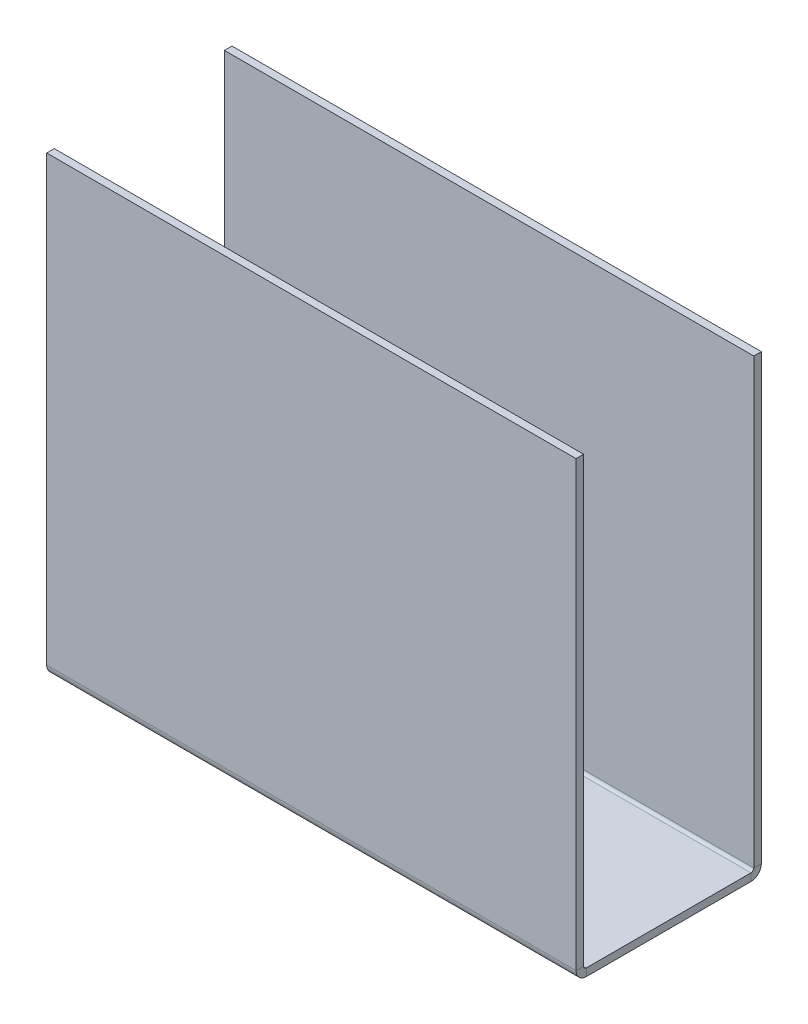
ISO-10303-21;
HEADER;
FILE_DESCRIPTION(('STEP AP214'),'2;1');
FILE_NAME('part.step','',(''),(''),'','','');
FILE_SCHEMA(('AUTOMOTIVE_DESIGN { 1 0 10303 214 1 1 1 1 }'));
ENDSEC;
DATA;
#1=APPLICATION_CONTEXT('core data for automotive mechanical design processes');
#2=APPLICATION_PROTOCOL_DEFINITION('international standard','automotive_design',2000,#1);
#3=PRODUCT_CONTEXT('',#1,'mechanical');
#4=PRODUCT('Part','Part','',(#3));
#5=PRODUCT_RELATED_PRODUCT_CATEGORY('part','',(#4));
#6=PRODUCT_DEFINITION_FORMATION('','',#4);
#7=PRODUCT_DEFINITION_CONTEXT('part definition',#1,'design');
#8=PRODUCT_DEFINITION('design','',#6,#7);
#9=PRODUCT_DEFINITION_SHAPE('','',#8);
#10=(LENGTH_UNIT() NAMED_UNIT(*) SI_UNIT(.MILLI.,.METRE.));
#11=(NAMED_UNIT(*) PLANE_ANGLE_UNIT() SI_UNIT($,.RADIAN.));
#12=(NAMED_UNIT(*) SI_UNIT($,.STERADIAN.) SOLID_ANGLE_UNIT());
#13=UNCERTAINTY_MEASURE_WITH_UNIT(LENGTH_MEASURE(1.E-05),#10,'distance_accuracy_value','');
#14=(GEOMETRIC_REPRESENTATION_CONTEXT(3) GLOBAL_UNCERTAINTY_ASSIGNED_CONTEXT((#13)) GLOBAL_UNIT_ASSIGNED_CONTEXT((#10,
#11,#12)) REPRESENTATION_CONTEXT('',''));
#15=CARTESIAN_POINT('',(0.,0.,0.));
#16=DIRECTION('',(0.,0.,1.));
#17=DIRECTION('',(1.,0.,0.));
#18=AXIS2_PLACEMENT_3D('',#15,#16,#17);
#19=CARTESIAN_POINT('',(0.,-2.,0.));
#20=DIRECTION('',(0.,1.,0.));
#21=DIRECTION('',(0.,0.,1.));
#22=AXIS2_PLACEMENT_3D('',#19,#20,#21);
#23=PLANE('',#22);
#24=DIRECTION('',(1.,0.,0.));
#25=VECTOR('',#24,1.);
#26=CARTESIAN_POINT('',(26.615107913669,-2.,33.4846230215827));
#27=LINE('',#26,#25);
#28=CARTESIAN_POINT('',(26.6151079136691,-2.,33.4846230215827));
#29=VERTEX_POINT('',#28);
#30=CARTESIAN_POINT('',(-113.384892086331,-2.,33.4846230215827));
#31=VERTEX_POINT('',#30);
#32=EDGE_CURVE('E211',#29,#31,#27,.F.);
#33=ORIENTED_EDGE('',*,*,#32,.T.);
#34=DIRECTION('',(0.,0.,1.));
#35=VECTOR('',#34,1.);
#36=CARTESIAN_POINT('',(-113.384892086331,-2.,-12.7787769784173));
#37=LINE('',#36,#35);
#38=CARTESIAN_POINT('',(-113.384892086331,-2.00000000000002,-10.0421769784173));
#39=VERTEX_POINT('',#38);
#40=EDGE_CURVE('E88',#39,#31,#37,.T.);
#41=ORIENTED_EDGE('',*,*,#40,.F.);
#42=DIRECTION('',(-1.,0.,0.));
#43=VECTOR('',#42,1.);
#44=CARTESIAN_POINT('',(-113.384892086331,-2.00000000000002,-10.0421769784173));
#45=LINE('',#44,#43);
#46=CARTESIAN_POINT('',(26.615107913669,-2.,-10.0421769784173));
#47=VERTEX_POINT('',#46);
#48=EDGE_CURVE('E264',#39,#47,#45,.F.);
#49=ORIENTED_EDGE('',*,*,#48,.T.);
#50=DIRECTION('',(0.,0.,-1.));
#51=VECTOR('',#50,1.);
#52=CARTESIAN_POINT('',(26.6151079136691,-2.,-12.7787769784173));
#53=LINE('',#52,#51);
#54=EDGE_CURVE('E13',#29,#47,#53,.T.);
#55=ORIENTED_EDGE('',*,*,#54,.F.);
#56=EDGE_LOOP('',(#33,#41,#49,#55));
#57=FACE_BOUND('',#56,.T.);
#58=ADVANCED_FACE('F79',(#57),#23,.F.);
#59=CARTESIAN_POINT('',(0.,0.,0.));
#60=DIRECTION('',(0.,1.,0.));
#61=DIRECTION('',(0.,0.,1.));
#62=AXIS2_PLACEMENT_3D('',#59,#60,#61);
#63=PLANE('',#62);
#64=DIRECTION('',(0.,0.,1.));
#65=VECTOR('',#64,1.);
#66=CARTESIAN_POINT('',(-113.384892086331,0.,-12.7787769784173));
#67=LINE('',#66,#65);
#68=CARTESIAN_POINT('',(-113.384892086331,0.,-10.0421769784173));
#69=VERTEX_POINT('',#68);
#70=CARTESIAN_POINT('',(-113.384892086331,0.,33.4846230215827));
#71=VERTEX_POINT('',#70);
#72=EDGE_CURVE('E282',#69,#71,#67,.T.);
#73=ORIENTED_EDGE('',*,*,#72,.T.);
#74=DIRECTION('',(1.,0.,0.));
#75=VECTOR('',#74,1.);
#76=CARTESIAN_POINT('',(26.615107913669,0.,33.4846230215827));
#77=LINE('',#76,#75);
#78=CARTESIAN_POINT('',(26.6151079136691,0.,33.4846230215827));
#79=VERTEX_POINT('',#78);
#80=EDGE_CURVE('E223',#79,#71,#77,.F.);
#81=ORIENTED_EDGE('',*,*,#80,.F.);
#82=DIRECTION('',(0.,0.,-1.));
#83=VECTOR('',#82,1.);
#84=CARTESIAN_POINT('',(26.6151079136691,0.,-12.7787769784173));
#85=LINE('',#84,#83);
#86=CARTESIAN_POINT('',(26.615107913669,0.,-10.0421769784173));
#87=VERTEX_POINT('',#86);
#88=EDGE_CURVE('E83',#79,#87,#85,.T.);
#89=ORIENTED_EDGE('',*,*,#88,.T.);
#90=DIRECTION('',(-1.,0.,0.));
#91=VECTOR('',#90,1.);
#92=CARTESIAN_POINT('',(-113.384892086331,0.,-10.0421769784173));
#93=LINE('',#92,#91);
#94=EDGE_CURVE('E96',#69,#87,#93,.F.);
#95=ORIENTED_EDGE('',*,*,#94,.F.);
#96=EDGE_LOOP('',(#73,#81,#89,#95));
#97=FACE_BOUND('',#96,.T.);
#98=ADVANCED_FACE('F287',(#97),#63,.T.);
#99=CARTESIAN_POINT('',(26.6151079136691,-2.,-12.7787769784173));
#100=DIRECTION('',(1.,0.,0.));
#101=DIRECTION('',(0.,0.,-1.));
#102=AXIS2_PLACEMENT_3D('',#99,#100,#101);
#103=PLANE('',#102);
#104=ORIENTED_EDGE('',*,*,#88,.F.);
#105=DIRECTION('',(0.,-1.,0.));
#106=VECTOR('',#105,1.);
#107=CARTESIAN_POINT('',(26.6151079136691,0.,33.4846230215827));
#108=LINE('',#107,#106);
#109=EDGE_CURVE('E217',#79,#29,#108,.T.);
#110=ORIENTED_EDGE('',*,*,#109,.T.);
#111=ORIENTED_EDGE('',*,*,#54,.T.);
#112=DIRECTION('',(0.,-1.,0.));
#113=VECTOR('',#112,1.);
#114=CARTESIAN_POINT('',(26.615107913669,0.,-10.0421769784173));
#115=LINE('',#114,#113);
#116=EDGE_CURVE('E279',#87,#47,#115,.T.);
#117=ORIENTED_EDGE('',*,*,#116,.F.);
#118=EDGE_LOOP('',(#104,#110,#111,#117));
#119=FACE_BOUND('',#118,.T.);
#120=ADVANCED_FACE('F289',(#119),#103,.T.);
#121=CARTESIAN_POINT('',(-113.384892086331,-2.,-12.7787769784173));
#122=DIRECTION('',(-1.,0.,0.));
#123=DIRECTION('',(0.,0.,1.));
#124=AXIS2_PLACEMENT_3D('',#121,#122,#123);
#125=PLANE('',#124);
#126=DIRECTION('',(0.,-1.,0.));
#127=VECTOR('',#126,1.);
#128=CARTESIAN_POINT('',(-113.384892086331,0.,33.4846230215827));
#129=LINE('',#128,#127);
#130=EDGE_CURVE('E229',#71,#31,#129,.T.);
#131=ORIENTED_EDGE('',*,*,#130,.F.);
#132=ORIENTED_EDGE('',*,*,#72,.F.);
#133=DIRECTION('',(0.,-1.,0.));
#134=VECTOR('',#133,1.);
#135=CARTESIAN_POINT('',(-113.384892086331,0.,-10.0421769784173));
#136=LINE('',#135,#134);
#137=EDGE_CURVE('E270',#69,#39,#136,.T.);
#138=ORIENTED_EDGE('',*,*,#137,.T.);
#139=ORIENTED_EDGE('',*,*,#40,.T.);
#140=EDGE_LOOP('',(#131,#132,#138,#139));
#141=FACE_BOUND('',#140,.T.);
#142=ADVANCED_FACE('F81',(#141),#125,.T.);
#143=CARTESIAN_POINT('',(26.615107913669,0.736599999999995,-10.0421769784173));
#144=DIRECTION('',(1.,0.,0.));
#145=DIRECTION('',(0.,1.,0.));
#146=AXIS2_PLACEMENT_3D('',#143,#144,#145);
#147=PLANE('',#146);
#148=DIRECTION('',(0.,0.,1.));
#149=VECTOR('',#148,1.);
#150=CARTESIAN_POINT('',(26.6151079136691,0.736600000000011,-12.7787769784173));
#151=LINE('',#150,#149);
#152=CARTESIAN_POINT('',(26.615107913669,0.736599999999993,-10.7787769784173));
#153=VERTEX_POINT('',#152);
#154=CARTESIAN_POINT('',(26.6151079136689,0.736599999999986,-12.7787769784173));
#155=VERTEX_POINT('',#154);
#156=EDGE_CURVE('E232',#153,#155,#151,.F.);
#157=ORIENTED_EDGE('',*,*,#156,.F.);
#158=CARTESIAN_POINT('',(26.615107913669,0.736599999999995,-10.0421769784173));
#159=DIRECTION('',(-1.,0.,0.));
#160=DIRECTION('',(0.,-1.,0.));
#161=AXIS2_PLACEMENT_3D('',#158,#159,#160);
#162=CIRCLE('',#161,0.7366);
#163=EDGE_CURVE('E273',#87,#153,#162,.F.);
#164=ORIENTED_EDGE('',*,*,#163,.F.);
#165=ORIENTED_EDGE('',*,*,#116,.T.);
#166=CARTESIAN_POINT('',(26.6151079136689,0.736599999999995,-10.0421769784173));
#167=DIRECTION('',(-1.,0.,0.));
#168=DIRECTION('',(0.,-1.,0.));
#169=AXIS2_PLACEMENT_3D('',#166,#167,#168);
#170=CIRCLE('',#169,2.7366);
#171=EDGE_CURVE('E266',#47,#155,#170,.F.);
#172=ORIENTED_EDGE('',*,*,#171,.T.);
#173=EDGE_LOOP('',(#157,#164,#165,#172));
#174=FACE_BOUND('',#173,.T.);
#175=ADVANCED_FACE('F297',(#174),#147,.T.);
#176=CARTESIAN_POINT('',(-113.384892086331,0.736599999999985,-10.0421769784173));
#177=DIRECTION('',(1.,0.,0.));
#178=DIRECTION('',(0.,1.,0.));
#179=AXIS2_PLACEMENT_3D('',#176,#177,#178);
#180=PLANE('',#179);
#181=CARTESIAN_POINT('',(-113.384892086331,0.736599999999985,-10.0421769784173));
#182=DIRECTION('',(-1.,0.,0.));
#183=DIRECTION('',(0.,-1.,0.));
#184=AXIS2_PLACEMENT_3D('',#181,#182,#183);
#185=CIRCLE('',#184,0.7366);
#186=CARTESIAN_POINT('',(-113.384892086331,0.736599999999982,-10.7787769784173));
#187=VERTEX_POINT('',#186);
#188=EDGE_CURVE('E237',#187,#69,#185,.T.);
#189=ORIENTED_EDGE('',*,*,#188,.F.);
#190=DIRECTION('',(0.,0.,1.));
#191=VECTOR('',#190,1.);
#192=CARTESIAN_POINT('',(-113.384892086331,0.736599999999993,-10.7787769784173));
#193=LINE('',#192,#191);
#194=CARTESIAN_POINT('',(-113.384892086331,0.736600000000007,-12.7787769784173));
#195=VERTEX_POINT('',#194);
#196=EDGE_CURVE('E257',#187,#195,#193,.F.);
#197=ORIENTED_EDGE('',*,*,#196,.T.);
#198=CARTESIAN_POINT('',(-113.384892086331,0.736599999999985,-10.0421769784173));
#199=DIRECTION('',(-1.,0.,0.));
#200=DIRECTION('',(0.,-1.,0.));
#201=AXIS2_PLACEMENT_3D('',#198,#199,#200);
#202=CIRCLE('',#201,2.7366);
#203=EDGE_CURVE('E267',#195,#39,#202,.T.);
#204=ORIENTED_EDGE('',*,*,#203,.T.);
#205=ORIENTED_EDGE('',*,*,#137,.F.);
#206=EDGE_LOOP('',(#189,#197,#204,#205));
#207=FACE_BOUND('',#206,.T.);
#208=ADVANCED_FACE('F318',(#207),#180,.F.);
#209=CARTESIAN_POINT('',(-113.384892086331,0.736599999999985,-10.0421769784173));
#210=DIRECTION('',(-1.,0.,0.));
#211=DIRECTION('',(0.,0.,-1.));
#212=AXIS2_PLACEMENT_3D('',#209,#210,#211);
#213=CYLINDRICAL_SURFACE('',#212,2.7366);
#214=ORIENTED_EDGE('',*,*,#48,.F.);
#215=ORIENTED_EDGE('',*,*,#203,.F.);
#216=DIRECTION('',(-1.,0.,0.));
#217=VECTOR('',#216,1.);
#218=CARTESIAN_POINT('',(26.6151079136691,0.736600000000011,-12.7787769784173));
#219=LINE('',#218,#217);
#220=EDGE_CURVE('E255',#195,#155,#219,.F.);
#221=ORIENTED_EDGE('',*,*,#220,.T.);
#222=ORIENTED_EDGE('',*,*,#171,.F.);
#223=EDGE_LOOP('',(#214,#215,#221,#222));
#224=FACE_BOUND('',#223,.T.);
#225=ADVANCED_FACE('F497',(#224),#213,.T.);
#226=CARTESIAN_POINT('',(-113.384892086331,0.736599999999985,-10.0421769784173));
#227=DIRECTION('',(-1.,0.,0.));
#228=DIRECTION('',(0.,0.,-1.));
#229=AXIS2_PLACEMENT_3D('',#226,#227,#228);
#230=CYLINDRICAL_SURFACE('',#229,0.7366);
#231=ORIENTED_EDGE('',*,*,#94,.T.);
#232=ORIENTED_EDGE('',*,*,#163,.T.);
#233=DIRECTION('',(-1.,0.,0.));
#234=VECTOR('',#233,1.);
#235=CARTESIAN_POINT('',(26.6151079136691,0.736599999999997,-10.7787769784173));
#236=LINE('',#235,#234);
#237=EDGE_CURVE('E260',#153,#187,#236,.T.);
#238=ORIENTED_EDGE('',*,*,#237,.T.);
#239=ORIENTED_EDGE('',*,*,#188,.T.);
#240=EDGE_LOOP('',(#231,#232,#238,#239));
#241=FACE_BOUND('',#240,.T.);
#242=ADVANCED_FACE('F294',(#241),#230,.F.);
#243=CARTESIAN_POINT('',(26.6151079136691,0.,-12.7787769784173));
#244=DIRECTION('',(-1.,0.,0.));
#245=DIRECTION('',(0.,0.,1.));
#246=AXIS2_PLACEMENT_3D('',#243,#244,#245);
#247=PLANE('',#246);
#248=ORIENTED_EDGE('',*,*,#156,.T.);
#249=DIRECTION('',(0.,-1.,0.));
#250=VECTOR('',#249,1.);
#251=CARTESIAN_POINT('',(26.6151079136691,0.,-12.7787769784173));
#252=LINE('',#251,#250);
#253=CARTESIAN_POINT('',(26.6151079136691,118.,-12.7787769784177));
#254=VERTEX_POINT('',#253);
#255=EDGE_CURVE('E245',#254,#155,#252,.T.);
#256=ORIENTED_EDGE('',*,*,#255,.F.);
#257=DIRECTION('',(0.,0.,1.));
#258=VECTOR('',#257,1.);
#259=CARTESIAN_POINT('',(26.6151079136691,118.,-12.7787769784177));
#260=LINE('',#259,#258);
#261=CARTESIAN_POINT('',(26.6151079136691,118.,-10.7787769784177));
#262=VERTEX_POINT('',#261);
#263=EDGE_CURVE('E238',#254,#262,#260,.T.);
#264=ORIENTED_EDGE('',*,*,#263,.T.);
#265=DIRECTION('',(0.,1.,0.));
#266=VECTOR('',#265,1.);
#267=CARTESIAN_POINT('',(26.6151079136691,0.,-10.7787769784173));
#268=LINE('',#267,#266);
#269=EDGE_CURVE('E252',#262,#153,#268,.F.);
#270=ORIENTED_EDGE('',*,*,#269,.T.);
#271=EDGE_LOOP('',(#248,#256,#264,#270));
#272=FACE_BOUND('',#271,.T.);
#273=ADVANCED_FACE('F300',(#272),#247,.F.);
#274=CARTESIAN_POINT('',(-113.384892086331,118.,-12.7787769784177));
#275=DIRECTION('',(1.,0.,0.));
#276=DIRECTION('',(0.,0.,-1.));
#277=AXIS2_PLACEMENT_3D('',#274,#275,#276);
#278=PLANE('',#277);
#279=ORIENTED_EDGE('',*,*,#196,.F.);
#280=DIRECTION('',(0.,-1.,0.));
#281=VECTOR('',#280,1.);
#282=CARTESIAN_POINT('',(-113.384892086331,118.,-10.7787769784177));
#283=LINE('',#282,#281);
#284=CARTESIAN_POINT('',(-113.384892086331,118.,-10.7787769784177));
#285=VERTEX_POINT('',#284);
#286=EDGE_CURVE('E250',#187,#285,#283,.F.);
#287=ORIENTED_EDGE('',*,*,#286,.T.);
#288=DIRECTION('',(0.,0.,1.));
#289=VECTOR('',#288,1.);
#290=CARTESIAN_POINT('',(-113.384892086331,118.,-12.7787769784177));
#291=LINE('',#290,#289);
#292=CARTESIAN_POINT('',(-113.384892086331,118.,-12.7787769784177));
#293=VERTEX_POINT('',#292);
#294=EDGE_CURVE('E234',#293,#285,#291,.T.);
#295=ORIENTED_EDGE('',*,*,#294,.F.);
#296=DIRECTION('',(0.,1.,0.));
#297=VECTOR('',#296,1.);
#298=CARTESIAN_POINT('',(-113.384892086331,0.,-12.7787769784173));
#299=LINE('',#298,#297);
#300=EDGE_CURVE('E243',#195,#293,#299,.T.);
#301=ORIENTED_EDGE('',*,*,#300,.F.);
#302=EDGE_LOOP('',(#279,#287,#295,#301));
#303=FACE_BOUND('',#302,.T.);
#304=ADVANCED_FACE('F320',(#303),#278,.F.);
#305=CARTESIAN_POINT('',(0.,0.,-12.7787769784173));
#306=DIRECTION('',(0.,0.,1.));
#307=DIRECTION('',(0.,-1.,0.));
#308=AXIS2_PLACEMENT_3D('',#305,#306,#307);
#309=PLANE('',#308);
#310=ORIENTED_EDGE('',*,*,#220,.F.);
#311=ORIENTED_EDGE('',*,*,#300,.T.);
#312=DIRECTION('',(1.,0.,0.));
#313=VECTOR('',#312,1.);
#314=CARTESIAN_POINT('',(0.,118.,-12.7787769784177));
#315=LINE('',#314,#313);
#316=EDGE_CURVE('E241',#293,#254,#315,.T.);
#317=ORIENTED_EDGE('',*,*,#316,.T.);
#318=ORIENTED_EDGE('',*,*,#255,.T.);
#319=EDGE_LOOP('',(#310,#311,#317,#318));
#320=FACE_BOUND('',#319,.T.);
#321=ADVANCED_FACE('F304',(#320),#309,.F.);
#322=CARTESIAN_POINT('',(0.,0.,-10.7787769784173));
#323=DIRECTION('',(0.,0.,1.));
#324=DIRECTION('',(0.,-1.,0.));
#325=AXIS2_PLACEMENT_3D('',#322,#323,#324);
#326=PLANE('',#325);
#327=ORIENTED_EDGE('',*,*,#286,.F.);
#328=ORIENTED_EDGE('',*,*,#237,.F.);
#329=ORIENTED_EDGE('',*,*,#269,.F.);
#330=DIRECTION('',(-1.,0.,0.));
#331=VECTOR('',#330,1.);
#332=CARTESIAN_POINT('',(26.6151079136691,118.,-10.7787769784177));
#333=LINE('',#332,#331);
#334=EDGE_CURVE('E248',#285,#262,#333,.F.);
#335=ORIENTED_EDGE('',*,*,#334,.F.);
#336=EDGE_LOOP('',(#327,#328,#329,#335));
#337=FACE_BOUND('',#336,.T.);
#338=ADVANCED_FACE('F314',(#337),#326,.T.);
#339=CARTESIAN_POINT('',(26.6151079136691,118.,-12.7787769784177));
#340=DIRECTION('',(0.,-1.,0.));
#341=DIRECTION('',(0.,0.,-1.));
#342=AXIS2_PLACEMENT_3D('',#339,#340,#341);
#343=PLANE('',#342);
#344=ORIENTED_EDGE('',*,*,#334,.T.);
#345=ORIENTED_EDGE('',*,*,#263,.F.);
#346=ORIENTED_EDGE('',*,*,#316,.F.);
#347=ORIENTED_EDGE('',*,*,#294,.T.);
#348=EDGE_LOOP('',(#344,#345,#346,#347));
#349=FACE_BOUND('',#348,.T.);
#350=ADVANCED_FACE('F310',(#349),#343,.F.);
#351=CARTESIAN_POINT('',(-113.384892086331,0.736599999999997,33.4846230215827));
#352=DIRECTION('',(-1.,0.,0.));
#353=DIRECTION('',(0.,0.,1.));
#354=AXIS2_PLACEMENT_3D('',#351,#352,#353);
#355=PLANE('',#354);
#356=DIRECTION('',(0.,0.,-1.));
#357=VECTOR('',#356,1.);
#358=CARTESIAN_POINT('',(-113.384892086331,0.736599999999997,36.2212230215827));
#359=LINE('',#358,#357);
#360=CARTESIAN_POINT('',(-113.384892086331,0.736599999999997,34.2212230215827));
#361=VERTEX_POINT('',#360);
#362=CARTESIAN_POINT('',(-113.384892086331,0.736599999999997,36.2212230215827));
#363=VERTEX_POINT('',#362);
#364=EDGE_CURVE('E194',#361,#363,#359,.F.);
#365=ORIENTED_EDGE('',*,*,#364,.F.);
#366=CARTESIAN_POINT('',(-113.384892086331,0.736599999999997,33.4846230215827));
#367=DIRECTION('',(1.,0.,0.));
#368=DIRECTION('',(0.,0.,-1.));
#369=AXIS2_PLACEMENT_3D('',#366,#367,#368);
#370=CIRCLE('',#369,0.736599999999997);
#371=EDGE_CURVE('E220',#71,#361,#370,.F.);
#372=ORIENTED_EDGE('',*,*,#371,.F.);
#373=ORIENTED_EDGE('',*,*,#130,.T.);
#374=CARTESIAN_POINT('',(-113.384892086331,0.736599999999997,33.4846230215827));
#375=DIRECTION('',(1.,0.,0.));
#376=DIRECTION('',(0.,0.,-1.));
#377=AXIS2_PLACEMENT_3D('',#374,#375,#376);
#378=CIRCLE('',#377,2.7366);
#379=EDGE_CURVE('E213',#31,#363,#378,.F.);
#380=ORIENTED_EDGE('',*,*,#379,.T.);
#381=EDGE_LOOP('',(#365,#372,#373,#380));
#382=FACE_BOUND('',#381,.T.);
#383=ADVANCED_FACE('F350',(#382),#355,.T.);
#384=CARTESIAN_POINT('',(26.6151079136691,0.736599999999997,33.4846230215827));
#385=DIRECTION('',(-1.,0.,0.));
#386=DIRECTION('',(0.,0.,1.));
#387=AXIS2_PLACEMENT_3D('',#384,#385,#386);
#388=PLANE('',#387);
#389=CARTESIAN_POINT('',(26.6151079136691,0.736599999999997,33.4846230215827));
#390=DIRECTION('',(1.,0.,0.));
#391=DIRECTION('',(0.,0.,-1.));
#392=AXIS2_PLACEMENT_3D('',#389,#390,#391);
#393=CIRCLE('',#392,0.736599999999997);
#394=CARTESIAN_POINT('',(26.6151079136691,0.736599999999997,34.2212230215827));
#395=VERTEX_POINT('',#394);
#396=EDGE_CURVE('E226',#395,#79,#393,.T.);
#397=ORIENTED_EDGE('',*,*,#396,.F.);
#398=DIRECTION('',(0.,0.,-1.));
#399=VECTOR('',#398,1.);
#400=CARTESIAN_POINT('',(26.6151079136691,0.736599999999997,34.2212230215827));
#401=LINE('',#400,#399);
#402=CARTESIAN_POINT('',(26.6151079136691,0.736599999999997,36.2212230215827));
#403=VERTEX_POINT('',#402);
#404=EDGE_CURVE('E205',#395,#403,#401,.F.);
#405=ORIENTED_EDGE('',*,*,#404,.T.);
#406=CARTESIAN_POINT('',(26.6151079136691,0.736599999999997,33.4846230215827));
#407=DIRECTION('',(1.,0.,0.));
#408=DIRECTION('',(0.,0.,-1.));
#409=AXIS2_PLACEMENT_3D('',#406,#407,#408);
#410=CIRCLE('',#409,2.7366);
#411=EDGE_CURVE('E214',#403,#29,#410,.T.);
#412=ORIENTED_EDGE('',*,*,#411,.T.);
#413=ORIENTED_EDGE('',*,*,#109,.F.);
#414=EDGE_LOOP('',(#397,#405,#412,#413));
#415=FACE_BOUND('',#414,.T.);
#416=ADVANCED_FACE('F366',(#415),#388,.F.);
#417=CARTESIAN_POINT('',(26.615107913669,0.736599999999997,33.4846230215827));
#418=DIRECTION('',(1.,0.,0.));
#419=DIRECTION('',(0.,0.,1.));
#420=AXIS2_PLACEMENT_3D('',#417,#418,#419);
#421=CYLINDRICAL_SURFACE('',#420,2.7366);
#422=ORIENTED_EDGE('',*,*,#32,.F.);
#423=ORIENTED_EDGE('',*,*,#411,.F.);
#424=DIRECTION('',(1.,0.,0.));
#425=VECTOR('',#424,1.);
#426=CARTESIAN_POINT('',(-113.384892086331,0.736599999999997,36.2212230215827));
#427=LINE('',#426,#425);
#428=EDGE_CURVE('E203',#403,#363,#427,.F.);
#429=ORIENTED_EDGE('',*,*,#428,.T.);
#430=ORIENTED_EDGE('',*,*,#379,.F.);
#431=EDGE_LOOP('',(#422,#423,#429,#430));
#432=FACE_BOUND('',#431,.T.);
#433=ADVANCED_FACE('F353',(#432),#421,.T.);
#434=CARTESIAN_POINT('',(26.615107913669,0.736599999999997,33.4846230215827));
#435=DIRECTION('',(1.,0.,0.));
#436=DIRECTION('',(0.,0.,1.));
#437=AXIS2_PLACEMENT_3D('',#434,#435,#436);
#438=CYLINDRICAL_SURFACE('',#437,0.736599999999997);
#439=ORIENTED_EDGE('',*,*,#80,.T.);
#440=ORIENTED_EDGE('',*,*,#371,.T.);
#441=DIRECTION('',(1.,0.,0.));
#442=VECTOR('',#441,1.);
#443=CARTESIAN_POINT('',(-113.384892086331,0.736599999999997,34.2212230215827));
#444=LINE('',#443,#442);
#445=EDGE_CURVE('E208',#361,#395,#444,.T.);
#446=ORIENTED_EDGE('',*,*,#445,.T.);
#447=ORIENTED_EDGE('',*,*,#396,.T.);
#448=EDGE_LOOP('',(#439,#440,#446,#447));
#449=FACE_BOUND('',#448,.T.);
#450=ADVANCED_FACE('F364',(#449),#438,.F.);
#451=CARTESIAN_POINT('',(-113.384892086331,0.,36.2212230215827));
#452=DIRECTION('',(1.,0.,0.));
#453=DIRECTION('',(0.,0.,-1.));
#454=AXIS2_PLACEMENT_3D('',#451,#452,#453);
#455=PLANE('',#454);
#456=ORIENTED_EDGE('',*,*,#364,.T.);
#457=DIRECTION('',(0.,-1.,0.));
#458=VECTOR('',#457,1.);
#459=CARTESIAN_POINT('',(-113.384892086331,0.,36.2212230215827));
#460=LINE('',#459,#458);
#461=CARTESIAN_POINT('',(-113.384892086331,118.,36.2212230215827));
#462=VERTEX_POINT('',#461);
#463=EDGE_CURVE('E175',#462,#363,#460,.T.);
#464=ORIENTED_EDGE('',*,*,#463,.F.);
#465=DIRECTION('',(0.,0.,-1.));
#466=VECTOR('',#465,1.);
#467=CARTESIAN_POINT('',(-113.384892086331,118.,36.2212230215827));
#468=LINE('',#467,#466);
#469=CARTESIAN_POINT('',(-113.384892086331,118.,34.2212230215827));
#470=VERTEX_POINT('',#469);
#471=EDGE_CURVE('E181',#462,#470,#468,.T.);
#472=ORIENTED_EDGE('',*,*,#471,.T.);
#473=DIRECTION('',(0.,1.,0.));
#474=VECTOR('',#473,1.);
#475=CARTESIAN_POINT('',(-113.384892086331,0.,34.2212230215827));
#476=LINE('',#475,#474);
#477=EDGE_CURVE('E201',#470,#361,#476,.F.);
#478=ORIENTED_EDGE('',*,*,#477,.T.);
#479=EDGE_LOOP('',(#456,#464,#472,#478));
#480=FACE_BOUND('',#479,.T.);
#481=ADVANCED_FACE('F193',(#480),#455,.F.);
#482=CARTESIAN_POINT('',(26.6151079136691,118.,36.2212230215827));
#483=DIRECTION('',(-1.,0.,0.));
#484=DIRECTION('',(0.,0.,1.));
#485=AXIS2_PLACEMENT_3D('',#482,#483,#484);
#486=PLANE('',#485);
#487=ORIENTED_EDGE('',*,*,#404,.F.);
#488=DIRECTION('',(0.,-1.,0.));
#489=VECTOR('',#488,1.);
#490=CARTESIAN_POINT('',(26.6151079136691,118.,34.2212230215827));
#491=LINE('',#490,#489);
#492=CARTESIAN_POINT('',(26.6151079136691,118.,34.2212230215827));
#493=VERTEX_POINT('',#492);
#494=EDGE_CURVE('E197',#395,#493,#491,.F.);
#495=ORIENTED_EDGE('',*,*,#494,.T.);
#496=DIRECTION('',(0.,0.,-1.));
#497=VECTOR('',#496,1.);
#498=CARTESIAN_POINT('',(26.6151079136691,118.,36.2212230215827));
#499=LINE('',#498,#497);
#500=CARTESIAN_POINT('',(26.6151079136691,118.,36.2212230215827));
#501=VERTEX_POINT('',#500);
#502=EDGE_CURVE('E190',#501,#493,#499,.T.);
#503=ORIENTED_EDGE('',*,*,#502,.F.);
#504=DIRECTION('',(0.,1.,0.));
#505=VECTOR('',#504,1.);
#506=CARTESIAN_POINT('',(26.6151079136691,0.,36.2212230215827));
#507=LINE('',#506,#505);
#508=EDGE_CURVE('E177',#403,#501,#507,.T.);
#509=ORIENTED_EDGE('',*,*,#508,.F.);
#510=EDGE_LOOP('',(#487,#495,#503,#509));
#511=FACE_BOUND('',#510,.T.);
#512=ADVANCED_FACE('F356',(#511),#486,.F.);
#513=CARTESIAN_POINT('',(0.,0.,36.2212230215827));
#514=DIRECTION('',(0.,0.,-1.));
#515=DIRECTION('',(-1.,0.,0.));
#516=AXIS2_PLACEMENT_3D('',#513,#514,#515);
#517=PLANE('',#516);
#518=ORIENTED_EDGE('',*,*,#428,.F.);
#519=ORIENTED_EDGE('',*,*,#508,.T.);
#520=DIRECTION('',(-1.,0.,0.));
#521=VECTOR('',#520,1.);
#522=CARTESIAN_POINT('',(0.,118.,36.2212230215827));
#523=LINE('',#522,#521);
#524=EDGE_CURVE('E170',#501,#462,#523,.T.);
#525=ORIENTED_EDGE('',*,*,#524,.T.);
#526=ORIENTED_EDGE('',*,*,#463,.T.);
#527=EDGE_LOOP('',(#518,#519,#525,#526));
#528=FACE_BOUND('',#527,.T.);
#529=ADVANCED_FACE('F173',(#528),#517,.F.);
#530=CARTESIAN_POINT('',(0.,0.,34.2212230215827));
#531=DIRECTION('',(0.,0.,-1.));
#532=DIRECTION('',(-1.,0.,0.));
#533=AXIS2_PLACEMENT_3D('',#530,#531,#532);
#534=PLANE('',#533);
#535=ORIENTED_EDGE('',*,*,#494,.F.);
#536=ORIENTED_EDGE('',*,*,#445,.F.);
#537=ORIENTED_EDGE('',*,*,#477,.F.);
#538=DIRECTION('',(1.,0.,0.));
#539=VECTOR('',#538,1.);
#540=CARTESIAN_POINT('',(-113.384892086331,118.,34.2212230215827));
#541=LINE('',#540,#539);
#542=EDGE_CURVE('E186',#493,#470,#541,.F.);
#543=ORIENTED_EDGE('',*,*,#542,.F.);
#544=EDGE_LOOP('',(#535,#536,#537,#543));
#545=FACE_BOUND('',#544,.T.);
#546=ADVANCED_FACE('F360',(#545),#534,.T.);
#547=CARTESIAN_POINT('',(-113.384892086331,118.,36.2212230215827));
#548=DIRECTION('',(0.,-1.,0.));
#549=DIRECTION('',(0.,0.,-1.));
#550=AXIS2_PLACEMENT_3D('',#547,#548,#549);
#551=PLANE('',#550);
#552=ORIENTED_EDGE('',*,*,#542,.T.);
#553=ORIENTED_EDGE('',*,*,#471,.F.);
#554=ORIENTED_EDGE('',*,*,#524,.F.);
#555=ORIENTED_EDGE('',*,*,#502,.T.);
#556=EDGE_LOOP('',(#552,#553,#554,#555));
#557=FACE_BOUND('',#556,.T.);
#558=ADVANCED_FACE('F184',(#557),#551,.F.);
#559=CLOSED_SHELL('',(#58,#98,#120,#142,#175,#208,#225,#242,#273,#304,#321,#338,#350,#383,#416,
#433,#450,#481,#512,#529,#546,#558));
#560=MANIFOLD_SOLID_BREP('B2',#559);
#561=ADVANCED_BREP_SHAPE_REPRESENTATION('',(#18,#560),#14);
#562=SHAPE_DEFINITION_REPRESENTATION(#9,#561);
ENDSEC;
END-ISO-10303-21;
